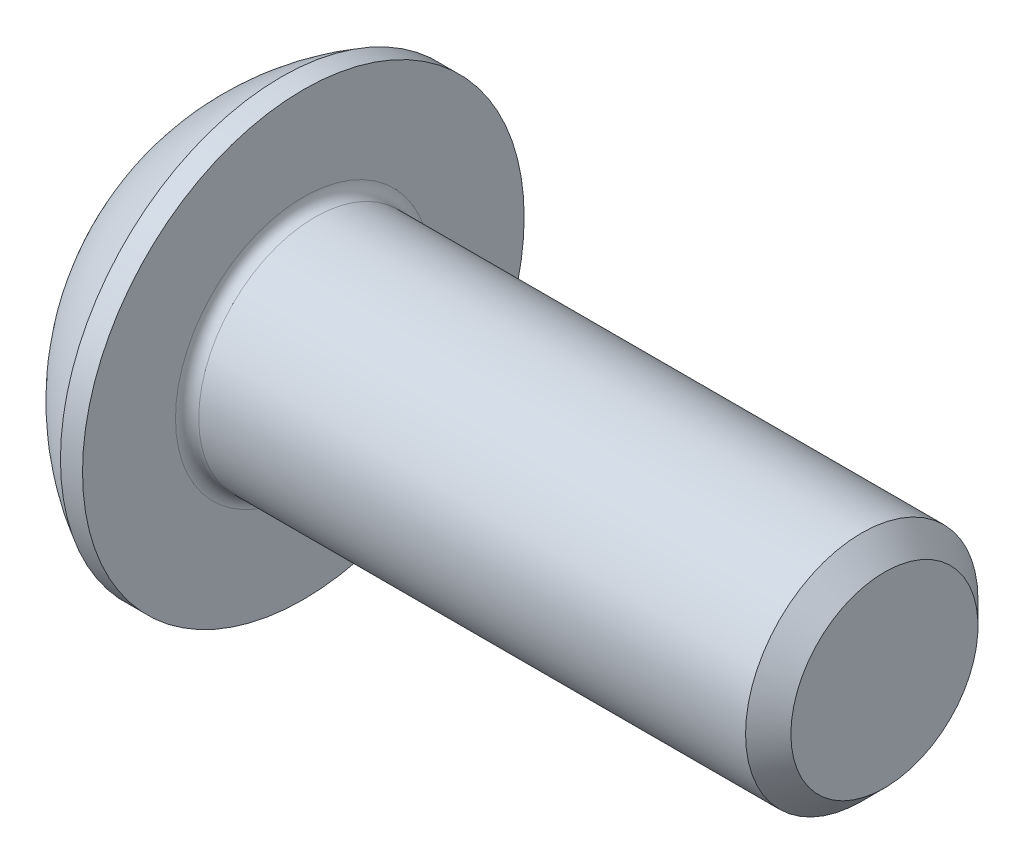
ISO-10303-21;
HEADER;
FILE_DESCRIPTION(('STEP AP214'),'2;1');
FILE_NAME('part.step','',(''),(''),'','','');
FILE_SCHEMA(('AUTOMOTIVE_DESIGN { 1 0 10303 214 1 1 1 1 }'));
ENDSEC;
DATA;
#1=APPLICATION_CONTEXT('core data for automotive mechanical design processes');
#2=APPLICATION_PROTOCOL_DEFINITION('international standard','automotive_design',2000,#1);
#3=PRODUCT_CONTEXT('',#1,'mechanical');
#4=PRODUCT('Part','Part','',(#3));
#5=PRODUCT_RELATED_PRODUCT_CATEGORY('part','',(#4));
#6=PRODUCT_DEFINITION_FORMATION('','',#4);
#7=PRODUCT_DEFINITION_CONTEXT('part definition',#1,'design');
#8=PRODUCT_DEFINITION('design','',#6,#7);
#9=PRODUCT_DEFINITION_SHAPE('','',#8);
#10=(LENGTH_UNIT() NAMED_UNIT(*) SI_UNIT(.MILLI.,.METRE.));
#11=(NAMED_UNIT(*) PLANE_ANGLE_UNIT() SI_UNIT($,.RADIAN.));
#12=(NAMED_UNIT(*) SI_UNIT($,.STERADIAN.) SOLID_ANGLE_UNIT());
#13=UNCERTAINTY_MEASURE_WITH_UNIT(LENGTH_MEASURE(1.E-05),#10,'distance_accuracy_value','');
#14=(GEOMETRIC_REPRESENTATION_CONTEXT(3) GLOBAL_UNCERTAINTY_ASSIGNED_CONTEXT((#13)) GLOBAL_UNIT_ASSIGNED_CONTEXT((#10,
#11,#12)) REPRESENTATION_CONTEXT('',''));
#15=CARTESIAN_POINT('',(0.,0.,0.));
#16=DIRECTION('',(0.,0.,1.));
#17=DIRECTION('',(1.,0.,0.));
#18=AXIS2_PLACEMENT_3D('',#15,#16,#17);
#19=CARTESIAN_POINT('',(0.,0.,0.));
#20=DIRECTION('',(-1.,0.,0.));
#21=DIRECTION('',(0.,0.,1.));
#22=AXIS2_PLACEMENT_3D('',#19,#20,#21);
#23=PLANE('',#22);
#24=CARTESIAN_POINT('',(0.,0.,0.));
#25=DIRECTION('',(-1.,0.,0.));
#26=DIRECTION('',(0.,0.,1.));
#27=AXIS2_PLACEMENT_3D('',#24,#25,#26);
#28=CIRCLE('',#27,1.9);
#29=CARTESIAN_POINT('',(0.,1.9,0.));
#30=VERTEX_POINT('',#29);
#31=EDGE_CURVE('E161',#30,#30,#28,.T.);
#32=ORIENTED_EDGE('',*,*,#31,.T.);
#33=EDGE_LOOP('',(#32));
#34=FACE_BOUND('',#33,.T.);
#35=DIRECTION('',(0.,-1.,0.));
#36=VECTOR('',#35,1.);
#37=CARTESIAN_POINT('',(0.,-0.721687836487032,1.25));
#38=LINE('',#37,#36);
#39=CARTESIAN_POINT('',(0.,0.721687836487032,1.25));
#40=VERTEX_POINT('',#39);
#41=CARTESIAN_POINT('',(0.,-0.721687836487032,1.25));
#42=VERTEX_POINT('',#41);
#43=EDGE_CURVE('E51',#40,#42,#38,.T.);
#44=ORIENTED_EDGE('',*,*,#43,.T.);
#45=DIRECTION('',(0.,-0.5,-0.866025403784439));
#46=VECTOR('',#45,1.);
#47=CARTESIAN_POINT('',(0.,-1.44337567297406,0.));
#48=LINE('',#47,#46);
#49=CARTESIAN_POINT('',(0.,-1.44337567297406,0.));
#50=VERTEX_POINT('',#49);
#51=EDGE_CURVE('E254',#42,#50,#48,.T.);
#52=ORIENTED_EDGE('',*,*,#51,.T.);
#53=DIRECTION('',(0.,0.5,-0.866025403784439));
#54=VECTOR('',#53,1.);
#55=CARTESIAN_POINT('',(0.,-0.721687836487032,-1.25));
#56=LINE('',#55,#54);
#57=CARTESIAN_POINT('',(0.,-0.721687836487032,-1.25));
#58=VERTEX_POINT('',#57);
#59=EDGE_CURVE('E136',#50,#58,#56,.T.);
#60=ORIENTED_EDGE('',*,*,#59,.T.);
#61=DIRECTION('',(0.,1.,0.));
#62=VECTOR('',#61,1.);
#63=CARTESIAN_POINT('',(0.,0.721687836487032,-1.25));
#64=LINE('',#63,#62);
#65=CARTESIAN_POINT('',(0.,0.721687836487032,-1.25));
#66=VERTEX_POINT('',#65);
#67=EDGE_CURVE('E257',#58,#66,#64,.T.);
#68=ORIENTED_EDGE('',*,*,#67,.T.);
#69=DIRECTION('',(0.,0.5,0.866025403784439));
#70=VECTOR('',#69,1.);
#71=CARTESIAN_POINT('',(0.,1.44337567297406,0.));
#72=LINE('',#71,#70);
#73=CARTESIAN_POINT('',(0.,1.44337567297406,0.));
#74=VERTEX_POINT('',#73);
#75=EDGE_CURVE('E259',#66,#74,#72,.T.);
#76=ORIENTED_EDGE('',*,*,#75,.T.);
#77=DIRECTION('',(0.,-0.5,0.866025403784439));
#78=VECTOR('',#77,1.);
#79=CARTESIAN_POINT('',(0.,0.721687836487032,1.25));
#80=LINE('',#79,#78);
#81=EDGE_CURVE('E261',#74,#40,#80,.T.);
#82=ORIENTED_EDGE('',*,*,#81,.T.);
#83=EDGE_LOOP('',(#44,#52,#60,#68,#76,#82));
#84=FACE_BOUND('',#83,.T.);
#85=ADVANCED_FACE('F36',(#34,#84),#23,.T.);
#86=CARTESIAN_POINT('',(3.88527472527473,0.,0.));
#87=DIRECTION('',(-1.,0.,0.));
#88=DIRECTION('',(0.,1.,0.));
#89=AXIS2_PLACEMENT_3D('',#86,#87,#88);
#90=SPHERICAL_SURFACE('',#89,4.3249693283142);
#91=CARTESIAN_POINT('',(1.82,0.,0.));
#92=DIRECTION('',(-1.,0.,0.));
#93=DIRECTION('',(0.,0.,1.));
#94=AXIS2_PLACEMENT_3D('',#91,#92,#93);
#95=CIRCLE('',#94,3.8);
#96=CARTESIAN_POINT('',(1.82,3.8,0.));
#97=VERTEX_POINT('',#96);
#98=EDGE_CURVE('E158',#97,#97,#95,.T.);
#99=CARTESIAN_POINT('',(1.82,3.8,0.));
#100=CARTESIAN_POINT('',(1.79553223778235,3.78670197498787,0.));
#101=CARTESIAN_POINT('',(1.77119294730718,3.77316757105695,0.));
#102=CARTESIAN_POINT('',(1.72278031308152,3.74563119292022,0.));
#103=CARTESIAN_POINT('',(1.69870696933103,3.7316292187144,0.));
#104=CARTESIAN_POINT('',(1.65083523179446,3.7031628875906,0.));
#105=CARTESIAN_POINT('',(1.62703683800837,3.6886985306726,0.));
#106=CARTESIAN_POINT('',(1.57972387446203,3.65931284095831,0.));
#107=CARTESIAN_POINT('',(1.55620930470177,3.64439150816201,0.));
#108=CARTESIAN_POINT('',(1.50947276449225,3.61409743150663,0.));
#109=CARTESIAN_POINT('',(1.48625079404298,3.59872468764754,0.));
#110=CARTESIAN_POINT('',(1.44010811665664,3.56753352546924,0.));
#111=CARTESIAN_POINT('',(1.41718740971957,3.55171510715004,0.));
#112=CARTESIAN_POINT('',(1.37165581166264,3.51963849804541,0.));
#113=CARTESIAN_POINT('',(1.34904492054277,3.50338030725998,0.));
#114=CARTESIAN_POINT('',(1.30414139068938,3.47043021954608,0.));
#115=CARTESIAN_POINT('',(1.28184875195586,3.45373832261761,0.));
#116=CARTESIAN_POINT('',(1.23759004473439,3.41992705070111,0.));
#117=CARTESIAN_POINT('',(1.21562397624644,3.40280767571308,0.));
#118=CARTESIAN_POINT('',(1.17202660551528,3.3681478352793,0.));
#119=CARTESIAN_POINT('',(1.15039530327208,3.35060736983354,0.));
#120=CARTESIAN_POINT('',(1.10747553612391,3.31511189319918,0.));
#121=CARTESIAN_POINT('',(1.08618707121895,3.29715688201057,0.));
#122=CARTESIAN_POINT('',(1.04396092192025,3.26083901328234,0.));
#123=CARTESIAN_POINT('',(1.02302323752651,3.24247615574272,0.));
#124=CARTESIAN_POINT('',(0.981506461539865,3.20534944588,0.));
#125=CARTESIAN_POINT('',(0.960927369946952,3.18658559355691,0.));
#126=CARTESIAN_POINT('',(0.920135458052999,3.14866389531445,0.));
#127=CARTESIAN_POINT('',(0.899922637751959,3.12950604939509,0.));
#128=CARTESIAN_POINT('',(0.859870810269304,3.09080351215454,0.));
#129=CARTESIAN_POINT('',(0.840031803087689,3.07125882083336,0.));
#130=CARTESIAN_POINT('',(0.800735004193913,3.0317898853238,0.));
#131=CARTESIAN_POINT('',(0.781277212481752,3.01186564113541,0.));
#132=CARTESIAN_POINT('',(0.74275010463742,2.97164503404517,0.));
#133=CARTESIAN_POINT('',(0.723680788505248,2.95134867114332,0.));
#134=CARTESIAN_POINT('',(0.685937746983035,2.91039139962521,0.));
#135=CARTESIAN_POINT('',(0.667264021592993,2.88973049100894,0.));
#136=CARTESIAN_POINT('',(0.630319129113973,2.84805183708071,0.));
#137=CARTESIAN_POINT('',(0.612047962024996,2.82703409176873,0.));
#138=CARTESIAN_POINT('',(0.575915003504077,2.78464960661105,0.));
#139=CARTESIAN_POINT('',(0.558053212072136,2.76328286676534,0.));
#140=CARTESIAN_POINT('',(0.522745669474639,2.72020836491933,0.));
#141=CARTESIAN_POINT('',(0.505299918309082,2.69850060291903,0.));
#142=CARTESIAN_POINT('',(0.470830965620255,2.65475215638556,0.));
#143=CARTESIAN_POINT('',(0.453807764096983,2.63271147185239,0.));
#144=CARTESIAN_POINT('',(0.420190262406822,2.58830540409509,0.));
#145=CARTESIAN_POINT('',(0.403595962239933,2.56594002087097,0.));
#146=CARTESIAN_POINT('',(0.370842454943267,2.52089290072626,0.));
#147=CARTESIAN_POINT('',(0.354683247813489,2.49821116380567,0.));
#148=CARTESIAN_POINT('',(0.322805955934172,2.45253979929826,0.));
#149=CARTESIAN_POINT('',(0.307087871184632,2.42955017171145,0.));
#150=CARTESIAN_POINT('',(0.276098688799191,2.38327160379141,0.));
#151=CARTESIAN_POINT('',(0.260827591163289,2.35998266345818,0.));
#152=CARTESIAN_POINT('',(0.230738081024336,2.31311415961106,0.));
#153=CARTESIAN_POINT('',(0.215919668521283,2.28953459609717,0.));
#154=CARTESIAN_POINT('',(0.186741057514276,2.24209364401868,0.));
#155=CARTESIAN_POINT('',(0.172380859010322,2.21823225545407,0.));
#156=CARTESIAN_POINT('',(0.144124034818959,2.17023655608655,0.));
#157=CARTESIAN_POINT('',(0.13022740913155,2.14610224528364,0.));
#158=CARTESIAN_POINT('',(0.102902912986768,2.09756970784785,0.));
#159=CARTESIAN_POINT('',(0.0894750425293929,2.07317148121498,0.));
#160=CARTESIAN_POINT('',(0.0630930771761377,2.02412021042083,0.));
#161=CARTESIAN_POINT('',(0.0501389822802572,1.99946716625955,0.));
#162=CARTESIAN_POINT('',(0.0247093637594994,1.94991547834234,0.));
#163=CARTESIAN_POINT('',(0.012233840134622,1.9250168345864,0.));
#164=CARTESIAN_POINT('',(0.,1.9,0.));
#165=B_SPLINE_CURVE_WITH_KNOTS('',3,(#99,#100,#101,#102,#103,#104,#105,#106,#107,#108,#109,#110,
#111,#112,#113,#114,#115,#116,#117,#118,#119,#120,#121,#122,#123,#124,#125,#126,#127,#128,#129,
#130,#131,#132,#133,#134,#135,#136,#137,#138,#139,#140,#141,#142,#143,#144,#145,#146,#147,#148,
#149,#150,#151,#152,#153,#154,#155,#156,#157,#158,#159,#160,#161,#162,#163,#164),.UNSPECIFIED.,
.F.,.F.,(4,2,2,2,2,2,2,2,2,2,2,2,2,2,2,2,2,2,2,2,2,2,2,2,2,2,2,2,2,2,2,2,4),(0.,
0.0835425780861792,0.167085156172358,0.250627734258538,0.334170312344717,0.417712890430895,
0.501255468517075,0.584798046603254,0.668340624689434,0.751883202775612,0.835425780861791,
0.918968358947971,1.00251093703415,1.08605351512033,1.16959609320651,1.25313867129269,
1.33668124937887,1.42022382746505,1.50376640555122,1.5873089836374,1.67085156172358,
1.75439413980976,1.83793671789594,1.92147929598212,2.0050218740683,2.08856445215448,
2.17210703024066,2.25564960832684,2.33919218641302,2.4227347644992,2.50627734258537,
2.58981992067155,2.67336249875773),.UNSPECIFIED.);
#166=EDGE_CURVE('BSEAM182',#97,#30,#165,.T.);
#167=ORIENTED_EDGE('',*,*,#98,.T.);
#168=ORIENTED_EDGE('',*,*,#31,.F.);
#169=ORIENTED_EDGE('',*,*,#166,.T.);
#170=ORIENTED_EDGE('',*,*,#166,.F.);
#171=EDGE_LOOP('',(#167,#169,#168,#170));
#172=FACE_BOUND('',#171,.T.);
#173=ADVANCED_FACE('F182',(#172),#90,.T.);
#174=CARTESIAN_POINT('',(0.,0.,0.));
#175=DIRECTION('',(-1.,0.,0.));
#176=DIRECTION('',(0.,0.,1.));
#177=AXIS2_PLACEMENT_3D('',#174,#175,#176);
#178=CYLINDRICAL_SURFACE('',#177,3.8);
#179=ORIENTED_EDGE('',*,*,#98,.F.);
#180=EDGE_LOOP('',(#179));
#181=FACE_BOUND('',#180,.T.);
#182=CARTESIAN_POINT('',(2.2,0.,0.));
#183=DIRECTION('',(-1.,0.,0.));
#184=DIRECTION('',(0.,0.,1.));
#185=AXIS2_PLACEMENT_3D('',#182,#183,#184);
#186=CIRCLE('',#185,3.8);
#187=CARTESIAN_POINT('',(2.2,0.,3.8));
#188=VERTEX_POINT('',#187);
#189=EDGE_CURVE('E155',#188,#188,#186,.T.);
#190=ORIENTED_EDGE('',*,*,#189,.T.);
#191=EDGE_LOOP('',(#190));
#192=FACE_BOUND('',#191,.T.);
#193=ADVANCED_FACE('F187',(#181,#192),#178,.T.);
#194=CARTESIAN_POINT('',(2.2,2.,0.));
#195=DIRECTION('',(-1.,0.,0.));
#196=DIRECTION('',(0.,0.,1.));
#197=AXIS2_PLACEMENT_3D('',#194,#195,#196);
#198=PLANE('',#197);
#199=CARTESIAN_POINT('',(2.2,0.,0.));
#200=DIRECTION('',(-1.,0.,0.));
#201=DIRECTION('',(0.,0.,1.));
#202=AXIS2_PLACEMENT_3D('',#199,#200,#201);
#203=CIRCLE('',#202,2.2);
#204=CARTESIAN_POINT('',(2.2,0.,2.2));
#205=VERTEX_POINT('',#204);
#206=EDGE_CURVE('E44',#205,#205,#203,.T.);
#207=ORIENTED_EDGE('',*,*,#206,.T.);
#208=EDGE_LOOP('',(#207));
#209=FACE_BOUND('',#208,.T.);
#210=ORIENTED_EDGE('',*,*,#189,.F.);
#211=EDGE_LOOP('',(#210));
#212=FACE_BOUND('',#211,.T.);
#213=ADVANCED_FACE('F166',(#209,#212),#198,.F.);
#214=CARTESIAN_POINT('',(0.,0.,0.));
#215=DIRECTION('',(-1.,0.,0.));
#216=DIRECTION('',(0.,0.,1.));
#217=AXIS2_PLACEMENT_3D('',#214,#215,#216);
#218=CYLINDRICAL_SURFACE('',#217,2.);
#219=CARTESIAN_POINT('',(2.4,0.,0.));
#220=DIRECTION('',(-1.,0.,0.));
#221=DIRECTION('',(0.,0.,1.));
#222=AXIS2_PLACEMENT_3D('',#219,#220,#221);
#223=CIRCLE('',#222,2.);
#224=CARTESIAN_POINT('',(2.4,0.,2.));
#225=VERTEX_POINT('',#224);
#226=EDGE_CURVE('E11',#225,#225,#223,.F.);
#227=ORIENTED_EDGE('',*,*,#226,.T.);
#228=EDGE_LOOP('',(#227));
#229=FACE_BOUND('',#228,.T.);
#230=CARTESIAN_POINT('',(11.81,0.,0.));
#231=DIRECTION('',(-1.,0.,0.));
#232=DIRECTION('',(0.,0.,1.));
#233=AXIS2_PLACEMENT_3D('',#230,#231,#232);
#234=CIRCLE('',#233,2.);
#235=CARTESIAN_POINT('',(11.81,0.,2.));
#236=VERTEX_POINT('',#235);
#237=EDGE_CURVE('E152',#236,#236,#234,.T.);
#238=ORIENTED_EDGE('',*,*,#237,.T.);
#239=EDGE_LOOP('',(#238));
#240=FACE_BOUND('',#239,.T.);
#241=ADVANCED_FACE('F196',(#229,#240),#218,.T.);
#242=CARTESIAN_POINT('',(12.2,0.,0.));
#243=DIRECTION('',(-1.,0.,0.));
#244=DIRECTION('',(0.,0.,1.));
#245=AXIS2_PLACEMENT_3D('',#242,#243,#244);
#246=CONICAL_SURFACE('',#245,1.61,0.785398163397449);
#247=ORIENTED_EDGE('',*,*,#237,.F.);
#248=EDGE_LOOP('',(#247));
#249=FACE_BOUND('',#248,.T.);
#250=CARTESIAN_POINT('',(12.2,0.,0.));
#251=DIRECTION('',(-1.,0.,0.));
#252=DIRECTION('',(0.,0.,1.));
#253=AXIS2_PLACEMENT_3D('',#250,#251,#252);
#254=CIRCLE('',#253,1.61);
#255=CARTESIAN_POINT('',(12.2,0.,1.61));
#256=VERTEX_POINT('',#255);
#257=EDGE_CURVE('E148',#256,#256,#254,.T.);
#258=ORIENTED_EDGE('',*,*,#257,.T.);
#259=EDGE_LOOP('',(#258));
#260=FACE_BOUND('',#259,.T.);
#261=ADVANCED_FACE('F177',(#249,#260),#246,.T.);
#262=CARTESIAN_POINT('',(12.2,0.,0.));
#263=DIRECTION('',(-1.,0.,0.));
#264=DIRECTION('',(0.,0.,1.));
#265=AXIS2_PLACEMENT_3D('',#262,#263,#264);
#266=PLANE('',#265);
#267=ORIENTED_EDGE('',*,*,#257,.F.);
#268=EDGE_LOOP('',(#267));
#269=FACE_BOUND('',#268,.T.);
#270=ADVANCED_FACE('F170',(#269),#266,.F.);
#271=CARTESIAN_POINT('',(2.4,0.,0.));
#272=DIRECTION('',(-1.,0.,0.));
#273=DIRECTION('',(0.,0.,1.));
#274=AXIS2_PLACEMENT_3D('',#271,#272,#273);
#275=TOROIDAL_SURFACE('',#274,2.2,0.2);
#276=ORIENTED_EDGE('',*,*,#226,.F.);
#277=EDGE_LOOP('',(#276));
#278=FACE_BOUND('',#277,.T.);
#279=ORIENTED_EDGE('',*,*,#206,.F.);
#280=EDGE_LOOP('',(#279));
#281=FACE_BOUND('',#280,.T.);
#282=ADVANCED_FACE('F38',(#278,#281),#275,.F.);
#283=CARTESIAN_POINT('',(1.3,-1.44337567297406,0.));
#284=DIRECTION('',(0.,0.866025403784439,-0.5));
#285=DIRECTION('',(0.,0.5,0.866025403784439));
#286=AXIS2_PLACEMENT_3D('',#283,#284,#285);
#287=PLANE('',#286);
#288=DIRECTION('',(0.,-0.5,-0.866025403784439));
#289=VECTOR('',#288,1.);
#290=CARTESIAN_POINT('',(1.3,-1.44337567297406,0.));
#291=LINE('',#290,#289);
#292=CARTESIAN_POINT('',(1.3,-0.721687836487032,1.25));
#293=VERTEX_POINT('',#292);
#294=CARTESIAN_POINT('',(1.3,-1.08253175473055,0.625));
#295=VERTEX_POINT('',#294);
#296=EDGE_CURVE('E119',#293,#295,#291,.T.);
#297=ORIENTED_EDGE('',*,*,#296,.T.);
#298=CARTESIAN_POINT('',(1.3,-1.44337567297406,0.));
#299=VERTEX_POINT('',#298);
#300=EDGE_CURVE('E112',#295,#299,#291,.T.);
#301=ORIENTED_EDGE('',*,*,#300,.T.);
#302=DIRECTION('',(-1.,0.,0.));
#303=VECTOR('',#302,1.);
#304=CARTESIAN_POINT('',(1.3,-1.44337567297406,0.));
#305=LINE('',#304,#303);
#306=EDGE_CURVE('E116',#299,#50,#305,.T.);
#307=ORIENTED_EDGE('',*,*,#306,.T.);
#308=ORIENTED_EDGE('',*,*,#51,.F.);
#309=DIRECTION('',(-1.,0.,0.));
#310=VECTOR('',#309,1.);
#311=CARTESIAN_POINT('',(1.3,-0.721687836487032,1.25));
#312=LINE('',#311,#310);
#313=EDGE_CURVE('E244',#293,#42,#312,.T.);
#314=ORIENTED_EDGE('',*,*,#313,.F.);
#315=EDGE_LOOP('',(#297,#301,#307,#308,#314));
#316=FACE_BOUND('',#315,.T.);
#317=ADVANCED_FACE('F114',(#316),#287,.T.);
#318=CARTESIAN_POINT('',(1.3,-0.721687836487032,-1.25));
#319=DIRECTION('',(0.,0.866025403784439,0.5));
#320=DIRECTION('',(0.,-0.5,0.866025403784439));
#321=AXIS2_PLACEMENT_3D('',#318,#319,#320);
#322=PLANE('',#321);
#323=DIRECTION('',(0.,0.5,-0.866025403784439));
#324=VECTOR('',#323,1.);
#325=CARTESIAN_POINT('',(1.3,-0.721687836487032,-1.25));
#326=LINE('',#325,#324);
#327=CARTESIAN_POINT('',(1.3,-1.08253175473055,-0.625));
#328=VERTEX_POINT('',#327);
#329=EDGE_CURVE('E124',#299,#328,#326,.T.);
#330=ORIENTED_EDGE('',*,*,#329,.T.);
#331=CARTESIAN_POINT('',(1.3,-0.721687836487032,-1.25));
#332=VERTEX_POINT('',#331);
#333=EDGE_CURVE('E131',#328,#332,#326,.T.);
#334=ORIENTED_EDGE('',*,*,#333,.T.);
#335=DIRECTION('',(-1.,0.,0.));
#336=VECTOR('',#335,1.);
#337=CARTESIAN_POINT('',(1.3,-0.721687836487032,-1.25));
#338=LINE('',#337,#336);
#339=EDGE_CURVE('E138',#332,#58,#338,.T.);
#340=ORIENTED_EDGE('',*,*,#339,.T.);
#341=ORIENTED_EDGE('',*,*,#59,.F.);
#342=ORIENTED_EDGE('',*,*,#306,.F.);
#343=EDGE_LOOP('',(#330,#334,#340,#341,#342));
#344=FACE_BOUND('',#343,.T.);
#345=ADVANCED_FACE('F134',(#344),#322,.T.);
#346=CARTESIAN_POINT('',(1.3,0.721687836487032,-1.25));
#347=DIRECTION('',(0.,0.,1.));
#348=DIRECTION('',(1.,0.,0.));
#349=AXIS2_PLACEMENT_3D('',#346,#347,#348);
#350=PLANE('',#349);
#351=DIRECTION('',(0.,1.,0.));
#352=VECTOR('',#351,1.);
#353=CARTESIAN_POINT('',(1.3,0.721687836487032,-1.25));
#354=LINE('',#353,#352);
#355=CARTESIAN_POINT('',(1.3,0.,-1.25));
#356=VERTEX_POINT('',#355);
#357=EDGE_CURVE('E280',#332,#356,#354,.T.);
#358=ORIENTED_EDGE('',*,*,#357,.T.);
#359=CARTESIAN_POINT('',(1.3,0.721687836487032,-1.25));
#360=VERTEX_POINT('',#359);
#361=EDGE_CURVE('E130',#356,#360,#354,.T.);
#362=ORIENTED_EDGE('',*,*,#361,.T.);
#363=DIRECTION('',(-1.,0.,0.));
#364=VECTOR('',#363,1.);
#365=CARTESIAN_POINT('',(1.3,0.721687836487032,-1.25));
#366=LINE('',#365,#364);
#367=EDGE_CURVE('E143',#360,#66,#366,.T.);
#368=ORIENTED_EDGE('',*,*,#367,.T.);
#369=ORIENTED_EDGE('',*,*,#67,.F.);
#370=ORIENTED_EDGE('',*,*,#339,.F.);
#371=EDGE_LOOP('',(#358,#362,#368,#369,#370));
#372=FACE_BOUND('',#371,.T.);
#373=ADVANCED_FACE('F210',(#372),#350,.T.);
#374=CARTESIAN_POINT('',(1.3,1.44337567297406,0.));
#375=DIRECTION('',(0.,-0.866025403784439,0.5));
#376=DIRECTION('',(0.,-0.5,-0.866025403784439));
#377=AXIS2_PLACEMENT_3D('',#374,#375,#376);
#378=PLANE('',#377);
#379=DIRECTION('',(0.,0.5,0.866025403784439));
#380=VECTOR('',#379,1.);
#381=CARTESIAN_POINT('',(1.3,1.44337567297406,0.));
#382=LINE('',#381,#380);
#383=CARTESIAN_POINT('',(1.3,1.08253175473055,-0.625));
#384=VERTEX_POINT('',#383);
#385=EDGE_CURVE('E286',#360,#384,#382,.T.);
#386=ORIENTED_EDGE('',*,*,#385,.T.);
#387=CARTESIAN_POINT('',(1.3,1.44337567297406,0.));
#388=VERTEX_POINT('',#387);
#389=EDGE_CURVE('E284',#384,#388,#382,.T.);
#390=ORIENTED_EDGE('',*,*,#389,.T.);
#391=DIRECTION('',(-1.,0.,0.));
#392=VECTOR('',#391,1.);
#393=CARTESIAN_POINT('',(1.3,1.44337567297406,0.));
#394=LINE('',#393,#392);
#395=EDGE_CURVE('E266',#388,#74,#394,.T.);
#396=ORIENTED_EDGE('',*,*,#395,.T.);
#397=ORIENTED_EDGE('',*,*,#75,.F.);
#398=ORIENTED_EDGE('',*,*,#367,.F.);
#399=EDGE_LOOP('',(#386,#390,#396,#397,#398));
#400=FACE_BOUND('',#399,.T.);
#401=ADVANCED_FACE('F213',(#400),#378,.T.);
#402=CARTESIAN_POINT('',(1.3,0.721687836487032,1.25));
#403=DIRECTION('',(0.,-0.866025403784439,-0.5));
#404=DIRECTION('',(0.,0.5,-0.866025403784439));
#405=AXIS2_PLACEMENT_3D('',#402,#403,#404);
#406=PLANE('',#405);
#407=DIRECTION('',(0.,-0.5,0.866025403784439));
#408=VECTOR('',#407,1.);
#409=CARTESIAN_POINT('',(1.3,0.721687836487032,1.25));
#410=LINE('',#409,#408);
#411=CARTESIAN_POINT('',(1.3,1.08253175473055,0.625));
#412=VERTEX_POINT('',#411);
#413=EDGE_CURVE('E250',#388,#412,#410,.T.);
#414=ORIENTED_EDGE('',*,*,#413,.T.);
#415=CARTESIAN_POINT('',(1.3,0.721687836487032,1.25));
#416=VERTEX_POINT('',#415);
#417=EDGE_CURVE('E242',#412,#416,#410,.T.);
#418=ORIENTED_EDGE('',*,*,#417,.T.);
#419=DIRECTION('',(-1.,0.,0.));
#420=VECTOR('',#419,1.);
#421=CARTESIAN_POINT('',(1.3,0.721687836487032,1.25));
#422=LINE('',#421,#420);
#423=EDGE_CURVE('E248',#416,#40,#422,.T.);
#424=ORIENTED_EDGE('',*,*,#423,.T.);
#425=ORIENTED_EDGE('',*,*,#81,.F.);
#426=ORIENTED_EDGE('',*,*,#395,.F.);
#427=EDGE_LOOP('',(#414,#418,#424,#425,#426));
#428=FACE_BOUND('',#427,.T.);
#429=ADVANCED_FACE('F217',(#428),#406,.T.);
#430=CARTESIAN_POINT('',(1.3,-0.721687836487032,1.25));
#431=DIRECTION('',(0.,0.,-1.));
#432=DIRECTION('',(0.,1.,0.));
#433=AXIS2_PLACEMENT_3D('',#430,#431,#432);
#434=PLANE('',#433);
#435=DIRECTION('',(0.,-1.,0.));
#436=VECTOR('',#435,1.);
#437=CARTESIAN_POINT('',(1.3,-0.721687836487032,1.25));
#438=LINE('',#437,#436);
#439=CARTESIAN_POINT('',(1.3,0.,1.25));
#440=VERTEX_POINT('',#439);
#441=EDGE_CURVE('E59',#416,#440,#438,.T.);
#442=ORIENTED_EDGE('',*,*,#441,.T.);
#443=EDGE_CURVE('E245',#440,#293,#438,.T.);
#444=ORIENTED_EDGE('',*,*,#443,.T.);
#445=ORIENTED_EDGE('',*,*,#313,.T.);
#446=ORIENTED_EDGE('',*,*,#43,.F.);
#447=ORIENTED_EDGE('',*,*,#423,.F.);
#448=EDGE_LOOP('',(#442,#444,#445,#446,#447));
#449=FACE_BOUND('',#448,.T.);
#450=ADVANCED_FACE('F221',(#449),#434,.T.);
#451=CARTESIAN_POINT('',(1.3,0.,2.5));
#452=DIRECTION('',(-1.,0.,0.));
#453=DIRECTION('',(0.,0.,1.));
#454=AXIS2_PLACEMENT_3D('',#451,#452,#453);
#455=PLANE('',#454);
#456=ORIENTED_EDGE('',*,*,#441,.F.);
#457=ORIENTED_EDGE('',*,*,#417,.F.);
#458=CARTESIAN_POINT('',(1.3,0.,0.));
#459=DIRECTION('',(-1.,0.,0.));
#460=DIRECTION('',(0.,0.,1.));
#461=AXIS2_PLACEMENT_3D('',#458,#459,#460);
#462=CIRCLE('',#461,1.25);
#463=EDGE_CURVE('E142',#440,#412,#462,.T.);
#464=ORIENTED_EDGE('',*,*,#463,.F.);
#465=EDGE_LOOP('',(#456,#457,#464));
#466=FACE_BOUND('',#465,.T.);
#467=ADVANCED_FACE('F225',(#466),#455,.T.);
#468=ORIENTED_EDGE('',*,*,#413,.F.);
#469=ORIENTED_EDGE('',*,*,#389,.F.);
#470=EDGE_CURVE('E149',#412,#384,#462,.T.);
#471=ORIENTED_EDGE('',*,*,#470,.F.);
#472=EDGE_LOOP('',(#468,#469,#471));
#473=FACE_BOUND('',#472,.T.);
#474=ADVANCED_FACE('F233',(#473),#455,.T.);
#475=ORIENTED_EDGE('',*,*,#385,.F.);
#476=ORIENTED_EDGE('',*,*,#361,.F.);
#477=EDGE_CURVE('E291',#384,#356,#462,.T.);
#478=ORIENTED_EDGE('',*,*,#477,.F.);
#479=EDGE_LOOP('',(#475,#476,#478));
#480=FACE_BOUND('',#479,.T.);
#481=ADVANCED_FACE('F238',(#480),#455,.T.);
#482=ORIENTED_EDGE('',*,*,#357,.F.);
#483=ORIENTED_EDGE('',*,*,#333,.F.);
#484=EDGE_CURVE('E283',#356,#328,#462,.T.);
#485=ORIENTED_EDGE('',*,*,#484,.F.);
#486=EDGE_LOOP('',(#482,#483,#485));
#487=FACE_BOUND('',#486,.T.);
#488=ADVANCED_FACE('F231',(#487),#455,.T.);
#489=ORIENTED_EDGE('',*,*,#329,.F.);
#490=ORIENTED_EDGE('',*,*,#300,.F.);
#491=EDGE_CURVE('E126',#328,#295,#462,.T.);
#492=ORIENTED_EDGE('',*,*,#491,.F.);
#493=EDGE_LOOP('',(#489,#490,#492));
#494=FACE_BOUND('',#493,.T.);
#495=ADVANCED_FACE('F125',(#494),#455,.T.);
#496=ORIENTED_EDGE('',*,*,#296,.F.);
#497=ORIENTED_EDGE('',*,*,#443,.F.);
#498=EDGE_CURVE('E137',#295,#440,#462,.T.);
#499=ORIENTED_EDGE('',*,*,#498,.F.);
#500=EDGE_LOOP('',(#496,#497,#499));
#501=FACE_BOUND('',#500,.T.);
#502=ADVANCED_FACE('F205',(#501),#455,.T.);
#503=CARTESIAN_POINT('',(2.02168783648704,0.,0.));
#504=DIRECTION('',(-1.,0.,0.));
#505=DIRECTION('',(0.,0.,1.));
#506=AXIS2_PLACEMENT_3D('',#503,#504,#505);
#507=CONICAL_SURFACE('',#506,0.,1.04719755119659);
#508=ORIENTED_EDGE('',*,*,#463,.T.);
#509=ORIENTED_EDGE('',*,*,#470,.T.);
#510=ORIENTED_EDGE('',*,*,#477,.T.);
#511=ORIENTED_EDGE('',*,*,#484,.T.);
#512=ORIENTED_EDGE('',*,*,#491,.T.);
#513=ORIENTED_EDGE('',*,*,#498,.T.);
#514=EDGE_LOOP('',(#508,#509,#510,#511,#512,#513));
#515=FACE_BOUND('',#514,.T.);
#516=CARTESIAN_POINT('',(2.02168783648704,0.,0.));
#517=VERTEX_POINT('',#516);
#518=VERTEX_LOOP('',#517);
#519=FACE_BOUND('',#518,.T.);
#520=ADVANCED_FACE('F203',(#515,#519),#507,.F.);
#521=CLOSED_SHELL('',(#85,#173,#193,#213,#241,#261,#270,#282,#317,#345,#373,#401,#429,#450,#467,
#474,#481,#488,#495,#502,#520));
#522=MANIFOLD_SOLID_BREP('B2',#521);
#523=ADVANCED_BREP_SHAPE_REPRESENTATION('',(#18,#522),#14);
#524=SHAPE_DEFINITION_REPRESENTATION(#9,#523);
ENDSEC;
END-ISO-10303-21;
